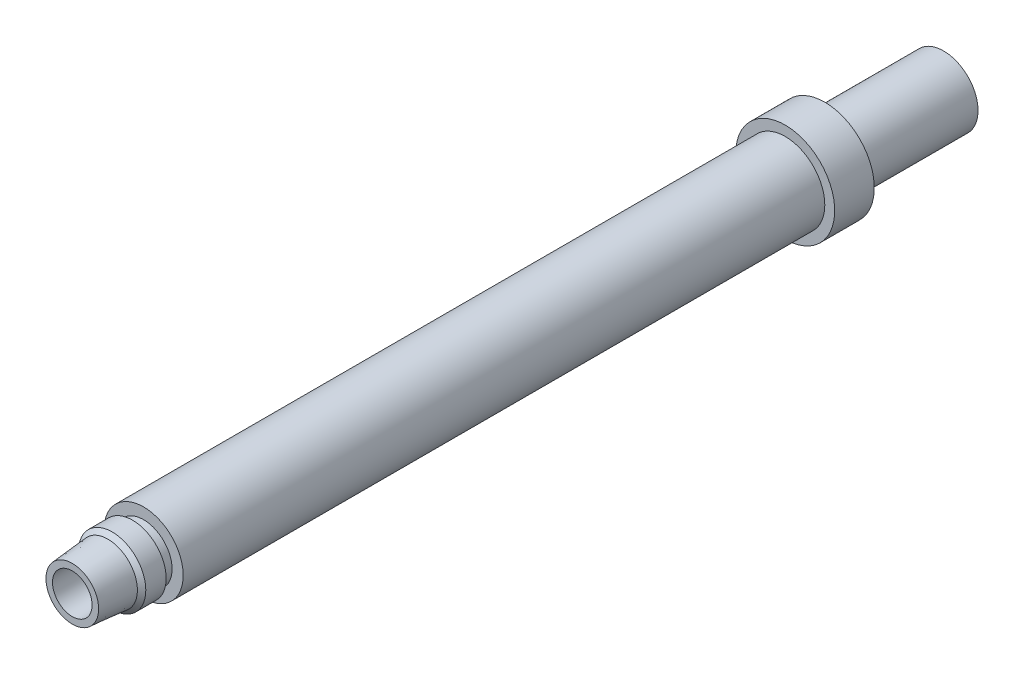
ISO-10303-21;
HEADER;
FILE_DESCRIPTION(('STEP AP214'),'2;1');
FILE_NAME('part.step','',(''),(''),'','','');
FILE_SCHEMA(('AUTOMOTIVE_DESIGN { 1 0 10303 214 1 1 1 1 }'));
ENDSEC;
DATA;
#1=APPLICATION_CONTEXT('core data for automotive mechanical design processes');
#2=APPLICATION_PROTOCOL_DEFINITION('international standard','automotive_design',2000,#1);
#3=PRODUCT_CONTEXT('',#1,'mechanical');
#4=PRODUCT('Part','Part','',(#3));
#5=PRODUCT_RELATED_PRODUCT_CATEGORY('part','',(#4));
#6=PRODUCT_DEFINITION_FORMATION('','',#4);
#7=PRODUCT_DEFINITION_CONTEXT('part definition',#1,'design');
#8=PRODUCT_DEFINITION('design','',#6,#7);
#9=PRODUCT_DEFINITION_SHAPE('','',#8);
#10=(LENGTH_UNIT() NAMED_UNIT(*) SI_UNIT(.MILLI.,.METRE.));
#11=(NAMED_UNIT(*) PLANE_ANGLE_UNIT() SI_UNIT($,.RADIAN.));
#12=(NAMED_UNIT(*) SI_UNIT($,.STERADIAN.) SOLID_ANGLE_UNIT());
#13=UNCERTAINTY_MEASURE_WITH_UNIT(LENGTH_MEASURE(1.E-05),#10,'distance_accuracy_value','');
#14=(GEOMETRIC_REPRESENTATION_CONTEXT(3) GLOBAL_UNCERTAINTY_ASSIGNED_CONTEXT((#13)) GLOBAL_UNIT_ASSIGNED_CONTEXT((#10,
#11,#12)) REPRESENTATION_CONTEXT('',''));
#15=CARTESIAN_POINT('',(0.,0.,0.));
#16=DIRECTION('',(0.,0.,1.));
#17=DIRECTION('',(1.,0.,0.));
#18=AXIS2_PLACEMENT_3D('',#15,#16,#17);
#19=CARTESIAN_POINT('',(0.,0.,139.7));
#20=DIRECTION('',(0.,0.,1.));
#21=DIRECTION('',(1.,0.,0.));
#22=AXIS2_PLACEMENT_3D('',#19,#20,#21);
#23=PLANE('',#22);
#24=CARTESIAN_POINT('',(0.,0.,139.7));
#25=DIRECTION('',(0.,0.,1.));
#26=DIRECTION('',(1.,0.,0.));
#27=AXIS2_PLACEMENT_3D('',#24,#25,#26);
#28=CIRCLE('',#27,3.175);
#29=CARTESIAN_POINT('',(3.175,0.,139.7));
#30=VERTEX_POINT('',#29);
#31=EDGE_CURVE('E12',#30,#30,#28,.T.);
#32=ORIENTED_EDGE('',*,*,#31,.F.);
#33=EDGE_LOOP('',(#32));
#34=FACE_BOUND('',#33,.T.);
#35=CARTESIAN_POINT('',(0.,0.,139.7));
#36=DIRECTION('',(0.,0.,1.));
#37=DIRECTION('',(1.,0.,0.));
#38=AXIS2_PLACEMENT_3D('',#35,#36,#37);
#39=CIRCLE('',#38,4.22440228794938);
#40=CARTESIAN_POINT('',(4.22440228794938,0.,139.7));
#41=VERTEX_POINT('',#40);
#42=EDGE_CURVE('E87',#41,#41,#39,.T.);
#43=ORIENTED_EDGE('',*,*,#42,.T.);
#44=EDGE_LOOP('',(#43));
#45=FACE_BOUND('',#44,.T.);
#46=ADVANCED_FACE('F47',(#34,#45),#23,.T.);
#47=CARTESIAN_POINT('',(0.,0.,-3.62514670569958));
#48=DIRECTION('',(0.,0.,1.));
#49=DIRECTION('',(1.,0.,0.));
#50=AXIS2_PLACEMENT_3D('',#47,#48,#49);
#51=CYLINDRICAL_SURFACE('',#50,6.35);
#52=CARTESIAN_POINT('',(0.,0.,25.4));
#53=DIRECTION('',(0.,0.,-1.));
#54=DIRECTION('',(-1.,0.,0.));
#55=AXIS2_PLACEMENT_3D('',#52,#53,#54);
#56=CIRCLE('',#55,6.35);
#57=CARTESIAN_POINT('',(-6.35,0.,25.4));
#58=VERTEX_POINT('',#57);
#59=EDGE_CURVE('E79',#58,#58,#56,.F.);
#60=ORIENTED_EDGE('',*,*,#59,.T.);
#61=EDGE_LOOP('',(#60));
#62=FACE_BOUND('',#61,.T.);
#63=CARTESIAN_POINT('',(0.,0.,128.27));
#64=DIRECTION('',(0.,0.,1.));
#65=DIRECTION('',(1.,0.,0.));
#66=AXIS2_PLACEMENT_3D('',#63,#64,#65);
#67=CIRCLE('',#66,6.35);
#68=CARTESIAN_POINT('',(6.35,0.,128.27));
#69=VERTEX_POINT('',#68);
#70=EDGE_CURVE('E91',#69,#69,#67,.T.);
#71=ORIENTED_EDGE('',*,*,#70,.F.);
#72=EDGE_LOOP('',(#71));
#73=FACE_BOUND('',#72,.T.);
#74=ADVANCED_FACE('F127',(#62,#73),#51,.T.);
#75=CARTESIAN_POINT('',(0.,0.,0.));
#76=DIRECTION('',(0.,0.,1.));
#77=DIRECTION('',(1.,0.,0.));
#78=AXIS2_PLACEMENT_3D('',#75,#76,#77);
#79=PLANE('',#78);
#80=CARTESIAN_POINT('',(0.,0.,0.));
#81=DIRECTION('',(0.,0.,1.));
#82=DIRECTION('',(1.,0.,0.));
#83=AXIS2_PLACEMENT_3D('',#80,#81,#82);
#84=CIRCLE('',#83,3.175);
#85=CARTESIAN_POINT('',(3.175,0.,0.));
#86=VERTEX_POINT('',#85);
#87=EDGE_CURVE('E56',#86,#86,#84,.T.);
#88=ORIENTED_EDGE('',*,*,#87,.T.);
#89=EDGE_LOOP('',(#88));
#90=FACE_BOUND('',#89,.T.);
#91=CARTESIAN_POINT('',(0.,0.,0.));
#92=DIRECTION('',(0.,0.,-1.));
#93=DIRECTION('',(-1.,0.,0.));
#94=AXIS2_PLACEMENT_3D('',#91,#92,#93);
#95=CIRCLE('',#94,5.5245);
#96=CARTESIAN_POINT('',(-5.5245,0.,0.));
#97=VERTEX_POINT('',#96);
#98=EDGE_CURVE('E65',#97,#97,#95,.T.);
#99=ORIENTED_EDGE('',*,*,#98,.T.);
#100=EDGE_LOOP('',(#99));
#101=FACE_BOUND('',#100,.T.);
#102=ADVANCED_FACE('F134',(#90,#101),#79,.F.);
#103=CARTESIAN_POINT('',(0.,0.,139.7));
#104=DIRECTION('',(0.,0.,-1.));
#105=DIRECTION('',(-1.,0.,0.));
#106=AXIS2_PLACEMENT_3D('',#103,#104,#105);
#107=CYLINDRICAL_SURFACE('',#106,7.9375);
#108=CARTESIAN_POINT('',(0.,0.,25.4));
#109=DIRECTION('',(0.,0.,-1.));
#110=DIRECTION('',(-1.,0.,0.));
#111=AXIS2_PLACEMENT_3D('',#108,#109,#110);
#112=CIRCLE('',#111,7.9375);
#113=CARTESIAN_POINT('',(-7.9375,0.,25.4));
#114=VERTEX_POINT('',#113);
#115=EDGE_CURVE('E51',#114,#114,#112,.T.);
#116=ORIENTED_EDGE('',*,*,#115,.T.);
#117=EDGE_LOOP('',(#116));
#118=FACE_BOUND('',#117,.T.);
#119=CARTESIAN_POINT('',(0.,0.,19.05));
#120=DIRECTION('',(0.,0.,-1.));
#121=DIRECTION('',(-1.,0.,0.));
#122=AXIS2_PLACEMENT_3D('',#119,#120,#121);
#123=CIRCLE('',#122,7.9375);
#124=CARTESIAN_POINT('',(-7.9375,0.,19.05));
#125=VERTEX_POINT('',#124);
#126=EDGE_CURVE('E62',#125,#125,#123,.T.);
#127=ORIENTED_EDGE('',*,*,#126,.F.);
#128=EDGE_LOOP('',(#127));
#129=FACE_BOUND('',#128,.T.);
#130=ADVANCED_FACE('F49',(#118,#129),#107,.T.);
#131=CARTESIAN_POINT('',(0.,0.,139.7));
#132=DIRECTION('',(0.,0.,-1.));
#133=DIRECTION('',(-1.,0.,0.));
#134=AXIS2_PLACEMENT_3D('',#131,#132,#133);
#135=CYLINDRICAL_SURFACE('',#134,3.175);
#136=ORIENTED_EDGE('',*,*,#31,.T.);
#137=EDGE_LOOP('',(#136));
#138=FACE_BOUND('',#137,.T.);
#139=ORIENTED_EDGE('',*,*,#87,.F.);
#140=EDGE_LOOP('',(#139));
#141=FACE_BOUND('',#140,.T.);
#142=ADVANCED_FACE('F139',(#138,#141),#135,.F.);
#143=CARTESIAN_POINT('',(0.,0.,19.05));
#144=DIRECTION('',(0.,0.,-1.));
#145=DIRECTION('',(-1.,0.,0.));
#146=AXIS2_PLACEMENT_3D('',#143,#144,#145);
#147=PLANE('',#146);
#148=CARTESIAN_POINT('',(0.,0.,19.05));
#149=DIRECTION('',(0.,0.,-1.));
#150=DIRECTION('',(-1.,0.,0.));
#151=AXIS2_PLACEMENT_3D('',#148,#149,#150);
#152=CIRCLE('',#151,5.5245);
#153=CARTESIAN_POINT('',(-5.5245,0.,19.05));
#154=VERTEX_POINT('',#153);
#155=EDGE_CURVE('E69',#154,#154,#152,.T.);
#156=ORIENTED_EDGE('',*,*,#155,.F.);
#157=EDGE_LOOP('',(#156));
#158=FACE_BOUND('',#157,.T.);
#159=ORIENTED_EDGE('',*,*,#126,.T.);
#160=EDGE_LOOP('',(#159));
#161=FACE_BOUND('',#160,.T.);
#162=ADVANCED_FACE('F156',(#158,#161),#147,.T.);
#163=CARTESIAN_POINT('',(0.,0.,19.05));
#164=DIRECTION('',(0.,0.,-1.));
#165=DIRECTION('',(-1.,0.,0.));
#166=AXIS2_PLACEMENT_3D('',#163,#164,#165);
#167=CYLINDRICAL_SURFACE('',#166,5.5245);
#168=CARTESIAN_POINT('',(-5.5245,0.,19.05));
#169=CARTESIAN_POINT('',(-5.5245,0.,18.8515625));
#170=CARTESIAN_POINT('',(-5.5245,0.,18.653125));
#171=CARTESIAN_POINT('',(-5.5245,0.,18.25625));
#172=CARTESIAN_POINT('',(-5.5245,0.,18.0578125));
#173=CARTESIAN_POINT('',(-5.5245,0.,17.6609375));
#174=CARTESIAN_POINT('',(-5.5245,0.,17.4625));
#175=CARTESIAN_POINT('',(-5.5245,0.,17.065625));
#176=CARTESIAN_POINT('',(-5.5245,0.,16.8671875));
#177=CARTESIAN_POINT('',(-5.5245,0.,16.4703125));
#178=CARTESIAN_POINT('',(-5.5245,0.,16.271875));
#179=CARTESIAN_POINT('',(-5.5245,0.,15.875));
#180=CARTESIAN_POINT('',(-5.5245,0.,15.6765625));
#181=CARTESIAN_POINT('',(-5.5245,0.,15.2796875));
#182=CARTESIAN_POINT('',(-5.5245,0.,15.08125));
#183=CARTESIAN_POINT('',(-5.5245,0.,14.684375));
#184=CARTESIAN_POINT('',(-5.5245,0.,14.4859375));
#185=CARTESIAN_POINT('',(-5.5245,0.,14.0890625));
#186=CARTESIAN_POINT('',(-5.5245,0.,13.890625));
#187=CARTESIAN_POINT('',(-5.5245,0.,13.49375));
#188=CARTESIAN_POINT('',(-5.5245,0.,13.2953125));
#189=CARTESIAN_POINT('',(-5.5245,0.,12.8984375));
#190=CARTESIAN_POINT('',(-5.5245,0.,12.7));
#191=CARTESIAN_POINT('',(-5.5245,0.,12.303125));
#192=CARTESIAN_POINT('',(-5.5245,0.,12.1046875));
#193=CARTESIAN_POINT('',(-5.5245,0.,11.7078125));
#194=CARTESIAN_POINT('',(-5.5245,0.,11.509375));
#195=CARTESIAN_POINT('',(-5.5245,0.,11.1125));
#196=CARTESIAN_POINT('',(-5.5245,0.,10.9140625));
#197=CARTESIAN_POINT('',(-5.5245,0.,10.5171875));
#198=CARTESIAN_POINT('',(-5.5245,0.,10.31875));
#199=CARTESIAN_POINT('',(-5.5245,0.,9.921875));
#200=CARTESIAN_POINT('',(-5.5245,0.,9.7234375));
#201=CARTESIAN_POINT('',(-5.5245,0.,9.3265625));
#202=CARTESIAN_POINT('',(-5.5245,0.,9.128125));
#203=CARTESIAN_POINT('',(-5.5245,0.,8.73125));
#204=CARTESIAN_POINT('',(-5.5245,0.,8.5328125));
#205=CARTESIAN_POINT('',(-5.5245,0.,8.1359375));
#206=CARTESIAN_POINT('',(-5.5245,0.,7.9375));
#207=CARTESIAN_POINT('',(-5.5245,0.,7.540625));
#208=CARTESIAN_POINT('',(-5.5245,0.,7.3421875));
#209=CARTESIAN_POINT('',(-5.5245,0.,6.9453125));
#210=CARTESIAN_POINT('',(-5.5245,0.,6.746875));
#211=CARTESIAN_POINT('',(-5.5245,0.,6.35));
#212=CARTESIAN_POINT('',(-5.5245,0.,6.1515625));
#213=CARTESIAN_POINT('',(-5.5245,0.,5.7546875));
#214=CARTESIAN_POINT('',(-5.5245,0.,5.55625));
#215=CARTESIAN_POINT('',(-5.5245,0.,5.159375));
#216=CARTESIAN_POINT('',(-5.5245,0.,4.9609375));
#217=CARTESIAN_POINT('',(-5.5245,0.,4.5640625));
#218=CARTESIAN_POINT('',(-5.5245,0.,4.365625));
#219=CARTESIAN_POINT('',(-5.5245,0.,3.96875));
#220=CARTESIAN_POINT('',(-5.5245,0.,3.7703125));
#221=CARTESIAN_POINT('',(-5.5245,0.,3.3734375));
#222=CARTESIAN_POINT('',(-5.5245,0.,3.175));
#223=CARTESIAN_POINT('',(-5.5245,0.,2.778125));
#224=CARTESIAN_POINT('',(-5.5245,0.,2.5796875));
#225=CARTESIAN_POINT('',(-5.5245,0.,2.1828125));
#226=CARTESIAN_POINT('',(-5.5245,0.,1.984375));
#227=CARTESIAN_POINT('',(-5.5245,0.,1.5875));
#228=CARTESIAN_POINT('',(-5.5245,0.,1.3890625));
#229=CARTESIAN_POINT('',(-5.5245,0.,0.992187500000001));
#230=CARTESIAN_POINT('',(-5.5245,0.,0.793750000000001));
#231=CARTESIAN_POINT('',(-5.5245,0.,0.396875));
#232=CARTESIAN_POINT('',(-5.5245,0.,0.1984375));
#233=CARTESIAN_POINT('',(-5.5245,0.,0.));
#234=B_SPLINE_CURVE_WITH_KNOTS('',3,(#168,#169,#170,#171,#172,#173,#174,#175,#176,#177,#178,
#179,#180,#181,#182,#183,#184,#185,#186,#187,#188,#189,#190,#191,#192,#193,#194,#195,#196,#197,
#198,#199,#200,#201,#202,#203,#204,#205,#206,#207,#208,#209,#210,#211,#212,#213,#214,#215,#216,
#217,#218,#219,#220,#221,#222,#223,#224,#225,#226,#227,#228,#229,#230,#231,#232,#233),
.UNSPECIFIED.,.F.,.F.,(4,2,2,2,2,2,2,2,2,2,2,2,2,2,2,2,2,2,2,2,2,2,2,2,2,2,2,2,2,2,2,2,4),(0.,
0.595312499999997,1.190625,1.7859375,2.38125,2.9765625,3.571875,4.1671875,4.7625,5.3578125,
5.953125,6.5484375,7.14375,7.7390625,8.334375,8.9296875,9.525,10.1203125,10.715625,11.3109375,
11.90625,12.5015625,13.096875,13.6921875,14.2875,14.8828125,15.478125,16.0734375,16.66875,
17.2640625,17.859375,18.4546875,19.05),.UNSPECIFIED.);
#235=EDGE_CURVE('BSEAM153',#154,#97,#234,.T.);
#236=ORIENTED_EDGE('',*,*,#155,.T.);
#237=ORIENTED_EDGE('',*,*,#98,.F.);
#238=ORIENTED_EDGE('',*,*,#235,.T.);
#239=ORIENTED_EDGE('',*,*,#235,.F.);
#240=EDGE_LOOP('',(#236,#238,#237,#239));
#241=FACE_BOUND('',#240,.T.);
#242=ADVANCED_FACE('F153',(#241),#167,.T.);
#243=CARTESIAN_POINT('',(0.,0.,25.4));
#244=DIRECTION('',(0.,0.,-1.));
#245=DIRECTION('',(-1.,0.,0.));
#246=AXIS2_PLACEMENT_3D('',#243,#244,#245);
#247=PLANE('',#246);
#248=ORIENTED_EDGE('',*,*,#59,.F.);
#249=EDGE_LOOP('',(#248));
#250=FACE_BOUND('',#249,.T.);
#251=ORIENTED_EDGE('',*,*,#115,.F.);
#252=EDGE_LOOP('',(#251));
#253=FACE_BOUND('',#252,.T.);
#254=ADVANCED_FACE('F155',(#250,#253),#247,.F.);
#255=CARTESIAN_POINT('',(0.,0.,133.985));
#256=DIRECTION('',(0.,0.,-1.));
#257=DIRECTION('',(-1.,0.,0.));
#258=AXIS2_PLACEMENT_3D('',#255,#256,#257);
#259=CONICAL_SURFACE('',#258,4.7244,0.78539816339744);
#260=CARTESIAN_POINT('',(0.,0.,133.3119));
#261=DIRECTION('',(0.,0.,1.));
#262=DIRECTION('',(1.,0.,0.));
#263=AXIS2_PLACEMENT_3D('',#260,#261,#262);
#264=CIRCLE('',#263,5.3975);
#265=CARTESIAN_POINT('',(5.3975,0.,133.3119));
#266=VERTEX_POINT('',#265);
#267=EDGE_CURVE('E107',#266,#266,#264,.T.);
#268=ORIENTED_EDGE('',*,*,#267,.T.);
#269=EDGE_LOOP('',(#268));
#270=FACE_BOUND('',#269,.T.);
#271=CARTESIAN_POINT('',(0.,0.,133.985));
#272=DIRECTION('',(0.,0.,1.));
#273=DIRECTION('',(1.,0.,0.));
#274=AXIS2_PLACEMENT_3D('',#271,#272,#273);
#275=CIRCLE('',#274,4.7244);
#276=CARTESIAN_POINT('',(4.7244,0.,133.985));
#277=VERTEX_POINT('',#276);
#278=EDGE_CURVE('E83',#277,#277,#275,.T.);
#279=ORIENTED_EDGE('',*,*,#278,.F.);
#280=EDGE_LOOP('',(#279));
#281=FACE_BOUND('',#280,.T.);
#282=ADVANCED_FACE('F112',(#270,#281),#259,.T.);
#283=CARTESIAN_POINT('',(0.,0.,139.7));
#284=DIRECTION('',(0.,0.,-1.));
#285=DIRECTION('',(-1.,0.,0.));
#286=AXIS2_PLACEMENT_3D('',#283,#284,#285);
#287=CONICAL_SURFACE('',#286,4.22440228794938,0.0872664625997099);
#288=ORIENTED_EDGE('',*,*,#278,.T.);
#289=EDGE_LOOP('',(#288));
#290=FACE_BOUND('',#289,.T.);
#291=ORIENTED_EDGE('',*,*,#42,.F.);
#292=EDGE_LOOP('',(#291));
#293=FACE_BOUND('',#292,.T.);
#294=ADVANCED_FACE('F166',(#290,#293),#287,.T.);
#295=CARTESIAN_POINT('',(0.,4.572,128.27));
#296=DIRECTION('',(0.,0.,1.));
#297=DIRECTION('',(1.,0.,0.));
#298=AXIS2_PLACEMENT_3D('',#295,#296,#297);
#299=PLANE('',#298);
#300=ORIENTED_EDGE('',*,*,#70,.T.);
#301=EDGE_LOOP('',(#300));
#302=FACE_BOUND('',#301,.T.);
#303=CARTESIAN_POINT('',(0.,0.,128.27));
#304=DIRECTION('',(0.,0.,1.));
#305=DIRECTION('',(1.,0.,0.));
#306=AXIS2_PLACEMENT_3D('',#303,#304,#305);
#307=CIRCLE('',#306,4.572);
#308=CARTESIAN_POINT('',(4.572,0.,128.27));
#309=VERTEX_POINT('',#308);
#310=EDGE_CURVE('E95',#309,#309,#307,.T.);
#311=ORIENTED_EDGE('',*,*,#310,.F.);
#312=EDGE_LOOP('',(#311));
#313=FACE_BOUND('',#312,.T.);
#314=ADVANCED_FACE('F169',(#302,#313),#299,.T.);
#315=CARTESIAN_POINT('',(0.,0.,139.7));
#316=DIRECTION('',(0.,0.,1.));
#317=DIRECTION('',(1.,0.,0.));
#318=AXIS2_PLACEMENT_3D('',#315,#316,#317);
#319=CYLINDRICAL_SURFACE('',#318,4.572);
#320=ORIENTED_EDGE('',*,*,#310,.T.);
#321=EDGE_LOOP('',(#320));
#322=FACE_BOUND('',#321,.T.);
#323=CARTESIAN_POINT('',(0.,0.,130.048));
#324=DIRECTION('',(0.,0.,1.));
#325=DIRECTION('',(1.,0.,0.));
#326=AXIS2_PLACEMENT_3D('',#323,#324,#325);
#327=CIRCLE('',#326,4.572);
#328=CARTESIAN_POINT('',(4.572,0.,130.048));
#329=VERTEX_POINT('',#328);
#330=EDGE_CURVE('E99',#329,#329,#327,.T.);
#331=ORIENTED_EDGE('',*,*,#330,.F.);
#332=EDGE_LOOP('',(#331));
#333=FACE_BOUND('',#332,.T.);
#334=ADVANCED_FACE('F123',(#322,#333),#319,.T.);
#335=CARTESIAN_POINT('',(0.,4.572,130.048));
#336=DIRECTION('',(0.,0.,-1.));
#337=DIRECTION('',(-1.,0.,0.));
#338=AXIS2_PLACEMENT_3D('',#335,#336,#337);
#339=PLANE('',#338);
#340=ORIENTED_EDGE('',*,*,#330,.T.);
#341=EDGE_LOOP('',(#340));
#342=FACE_BOUND('',#341,.T.);
#343=CARTESIAN_POINT('',(0.,0.,130.048));
#344=DIRECTION('',(0.,0.,1.));
#345=DIRECTION('',(1.,0.,0.));
#346=AXIS2_PLACEMENT_3D('',#343,#344,#345);
#347=CIRCLE('',#346,5.3975);
#348=CARTESIAN_POINT('',(5.3975,0.,130.048));
#349=VERTEX_POINT('',#348);
#350=EDGE_CURVE('E103',#349,#349,#347,.T.);
#351=ORIENTED_EDGE('',*,*,#350,.F.);
#352=EDGE_LOOP('',(#351));
#353=FACE_BOUND('',#352,.T.);
#354=ADVANCED_FACE('F117',(#342,#353),#339,.T.);
#355=CARTESIAN_POINT('',(0.,0.,139.7));
#356=DIRECTION('',(0.,0.,1.));
#357=DIRECTION('',(1.,0.,0.));
#358=AXIS2_PLACEMENT_3D('',#355,#356,#357);
#359=CYLINDRICAL_SURFACE('',#358,5.3975);
#360=ORIENTED_EDGE('',*,*,#350,.T.);
#361=EDGE_LOOP('',(#360));
#362=FACE_BOUND('',#361,.T.);
#363=ORIENTED_EDGE('',*,*,#267,.F.);
#364=EDGE_LOOP('',(#363));
#365=FACE_BOUND('',#364,.T.);
#366=ADVANCED_FACE('F115',(#362,#365),#359,.T.);
#367=CLOSED_SHELL('',(#46,#74,#102,#130,#142,#162,#242,#254,#282,#294,#314,#334,#354,#366));
#368=MANIFOLD_SOLID_BREP('B2',#367);
#369=ADVANCED_BREP_SHAPE_REPRESENTATION('',(#18,#368),#14);
#370=SHAPE_DEFINITION_REPRESENTATION(#9,#369);
ENDSEC;
END-ISO-10303-21;
